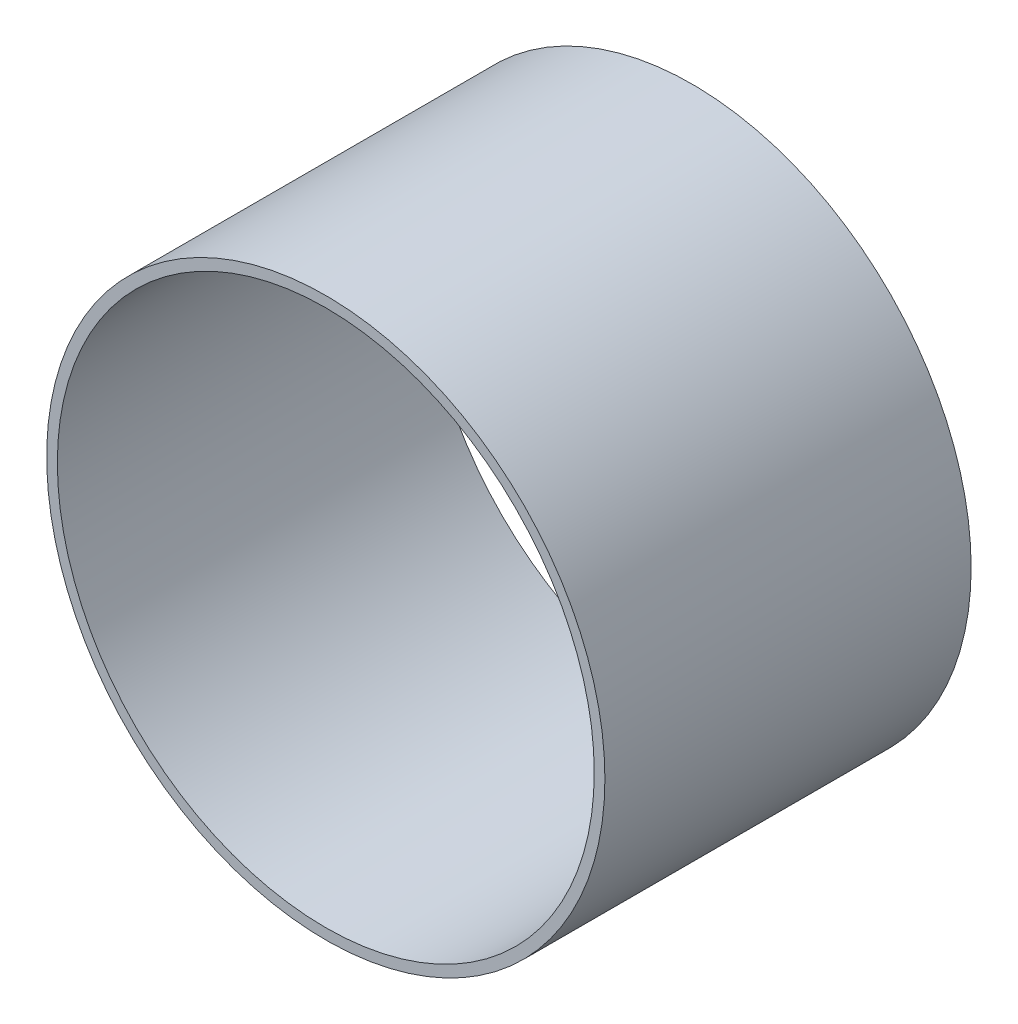
ISO-10303-21;
HEADER;
FILE_DESCRIPTION(('STEP AP214'),'2;1');
FILE_NAME('part.step','',(''),(''),'','','');
FILE_SCHEMA(('AUTOMOTIVE_DESIGN { 1 0 10303 214 1 1 1 1 }'));
ENDSEC;
DATA;
#1=APPLICATION_CONTEXT('core data for automotive mechanical design processes');
#2=APPLICATION_PROTOCOL_DEFINITION('international standard','automotive_design',2000,#1);
#3=PRODUCT_CONTEXT('',#1,'mechanical');
#4=PRODUCT('Part','Part','',(#3));
#5=PRODUCT_RELATED_PRODUCT_CATEGORY('part','',(#4));
#6=PRODUCT_DEFINITION_FORMATION('','',#4);
#7=PRODUCT_DEFINITION_CONTEXT('part definition',#1,'design');
#8=PRODUCT_DEFINITION('design','',#6,#7);
#9=PRODUCT_DEFINITION_SHAPE('','',#8);
#10=(LENGTH_UNIT() NAMED_UNIT(*) SI_UNIT(.MILLI.,.METRE.));
#11=(NAMED_UNIT(*) PLANE_ANGLE_UNIT() SI_UNIT($,.RADIAN.));
#12=(NAMED_UNIT(*) SI_UNIT($,.STERADIAN.) SOLID_ANGLE_UNIT());
#13=UNCERTAINTY_MEASURE_WITH_UNIT(LENGTH_MEASURE(1.E-05),#10,'distance_accuracy_value','');
#14=(GEOMETRIC_REPRESENTATION_CONTEXT(3) GLOBAL_UNCERTAINTY_ASSIGNED_CONTEXT((#13)) GLOBAL_UNIT_ASSIGNED_CONTEXT((#10,
#11,#12)) REPRESENTATION_CONTEXT('',''));
#15=CARTESIAN_POINT('',(0.,0.,0.));
#16=DIRECTION('',(0.,0.,1.));
#17=DIRECTION('',(1.,0.,0.));
#18=AXIS2_PLACEMENT_3D('',#15,#16,#17);
#19=CARTESIAN_POINT('',(0.,0.,58.5));
#20=DIRECTION('',(0.,0.,1.));
#21=DIRECTION('',(1.,0.,0.));
#22=AXIS2_PLACEMENT_3D('',#19,#20,#21);
#23=PLANE('',#22);
#24=CARTESIAN_POINT('',(0.,0.,58.5));
#25=DIRECTION('',(0.,0.,1.));
#26=DIRECTION('',(1.,0.,0.));
#27=AXIS2_PLACEMENT_3D('',#24,#25,#26);
#28=CIRCLE('',#27,78.5);
#29=CARTESIAN_POINT('',(78.5,0.,58.5));
#30=VERTEX_POINT('',#29);
#31=EDGE_CURVE('E10',#30,#30,#28,.T.);
#32=ORIENTED_EDGE('',*,*,#31,.T.);
#33=EDGE_LOOP('',(#32));
#34=FACE_BOUND('',#33,.T.);
#35=CARTESIAN_POINT('',(0.,0.,58.5));
#36=DIRECTION('',(0.,0.,1.));
#37=DIRECTION('',(1.,0.,0.));
#38=AXIS2_PLACEMENT_3D('',#35,#36,#37);
#39=CIRCLE('',#38,75.5);
#40=CARTESIAN_POINT('',(75.5,0.,58.5));
#41=VERTEX_POINT('',#40);
#42=EDGE_CURVE('E50',#41,#41,#39,.T.);
#43=ORIENTED_EDGE('',*,*,#42,.F.);
#44=EDGE_LOOP('',(#43));
#45=FACE_BOUND('',#44,.T.);
#46=ADVANCED_FACE('F36',(#34,#45),#23,.T.);
#47=CARTESIAN_POINT('',(0.,0.,-44.5));
#48=DIRECTION('',(0.,0.,1.));
#49=DIRECTION('',(1.,0.,0.));
#50=AXIS2_PLACEMENT_3D('',#47,#48,#49);
#51=PLANE('',#50);
#52=CARTESIAN_POINT('',(0.,0.,-44.5));
#53=DIRECTION('',(0.,0.,1.));
#54=DIRECTION('',(1.,0.,0.));
#55=AXIS2_PLACEMENT_3D('',#52,#53,#54);
#56=CIRCLE('',#55,78.5);
#57=CARTESIAN_POINT('',(78.5,0.,-44.5));
#58=VERTEX_POINT('',#57);
#59=EDGE_CURVE('E40',#58,#58,#56,.T.);
#60=ORIENTED_EDGE('',*,*,#59,.F.);
#61=EDGE_LOOP('',(#60));
#62=FACE_BOUND('',#61,.T.);
#63=CARTESIAN_POINT('',(0.,0.,-44.5));
#64=DIRECTION('',(0.,0.,1.));
#65=DIRECTION('',(1.,0.,0.));
#66=AXIS2_PLACEMENT_3D('',#63,#64,#65);
#67=CIRCLE('',#66,75.5);
#68=CARTESIAN_POINT('',(75.5,0.,-44.5));
#69=VERTEX_POINT('',#68);
#70=EDGE_CURVE('E52',#69,#69,#67,.T.);
#71=ORIENTED_EDGE('',*,*,#70,.T.);
#72=EDGE_LOOP('',(#71));
#73=FACE_BOUND('',#72,.T.);
#74=ADVANCED_FACE('F63',(#62,#73),#51,.F.);
#75=CARTESIAN_POINT('',(0.,0.,58.5));
#76=DIRECTION('',(0.,0.,-1.));
#77=DIRECTION('',(-1.,0.,0.));
#78=AXIS2_PLACEMENT_3D('',#75,#76,#77);
#79=CYLINDRICAL_SURFACE('',#78,78.5);
#80=ORIENTED_EDGE('',*,*,#31,.F.);
#81=EDGE_LOOP('',(#80));
#82=FACE_BOUND('',#81,.T.);
#83=ORIENTED_EDGE('',*,*,#59,.T.);
#84=EDGE_LOOP('',(#83));
#85=FACE_BOUND('',#84,.T.);
#86=ADVANCED_FACE('F38',(#82,#85),#79,.T.);
#87=CARTESIAN_POINT('',(0.,0.,58.5));
#88=DIRECTION('',(0.,0.,-1.));
#89=DIRECTION('',(-1.,0.,0.));
#90=AXIS2_PLACEMENT_3D('',#87,#88,#89);
#91=CYLINDRICAL_SURFACE('',#90,75.5);
#92=ORIENTED_EDGE('',*,*,#42,.T.);
#93=EDGE_LOOP('',(#92));
#94=FACE_BOUND('',#93,.T.);
#95=ORIENTED_EDGE('',*,*,#70,.F.);
#96=EDGE_LOOP('',(#95));
#97=FACE_BOUND('',#96,.T.);
#98=ADVANCED_FACE('F59',(#94,#97),#91,.F.);
#99=CLOSED_SHELL('',(#46,#74,#86,#98));
#100=MANIFOLD_SOLID_BREP('B2',#99);
#101=ADVANCED_BREP_SHAPE_REPRESENTATION('',(#18,#100),#14);
#102=SHAPE_DEFINITION_REPRESENTATION(#9,#101);
ENDSEC;
END-ISO-10303-21;
